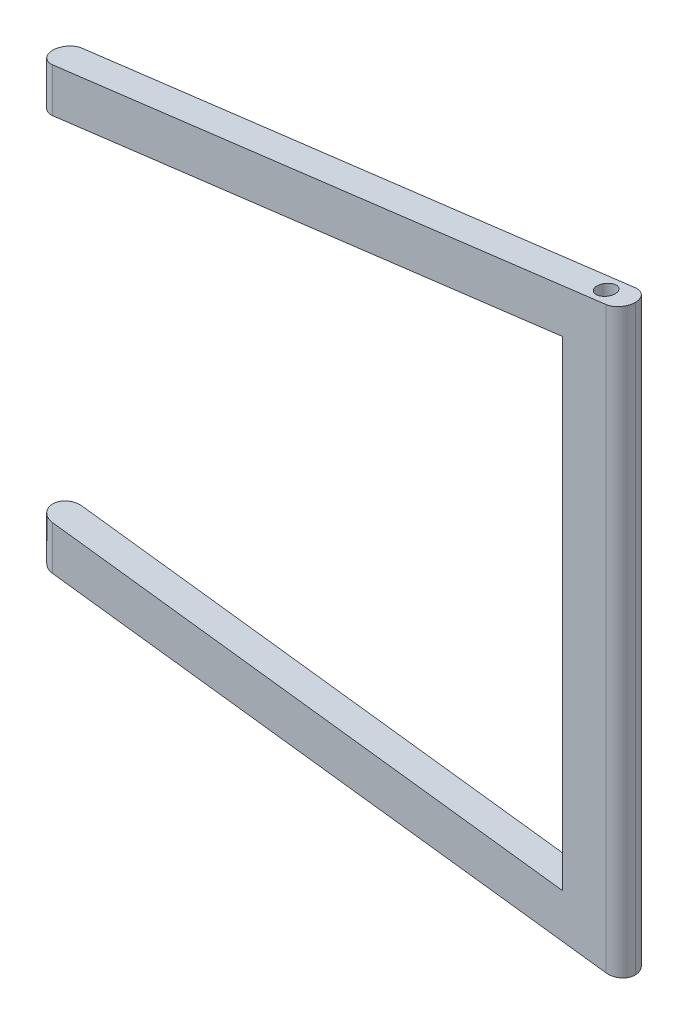
ISO-10303-21;
HEADER;
FILE_DESCRIPTION(('STEP AP214'),'2;1');
FILE_NAME('part.step','',(''),(''),'','','');
FILE_SCHEMA(('AUTOMOTIVE_DESIGN { 1 0 10303 214 1 1 1 1 }'));
ENDSEC;
DATA;
#1=APPLICATION_CONTEXT('core data for automotive mechanical design processes');
#2=APPLICATION_PROTOCOL_DEFINITION('international standard','automotive_design',2000,#1);
#3=PRODUCT_CONTEXT('',#1,'mechanical');
#4=PRODUCT('Part','Part','',(#3));
#5=PRODUCT_RELATED_PRODUCT_CATEGORY('part','',(#4));
#6=PRODUCT_DEFINITION_FORMATION('','',#4);
#7=PRODUCT_DEFINITION_CONTEXT('part definition',#1,'design');
#8=PRODUCT_DEFINITION('design','',#6,#7);
#9=PRODUCT_DEFINITION_SHAPE('','',#8);
#10=(LENGTH_UNIT() NAMED_UNIT(*) SI_UNIT(.MILLI.,.METRE.));
#11=(NAMED_UNIT(*) PLANE_ANGLE_UNIT() SI_UNIT($,.RADIAN.));
#12=(NAMED_UNIT(*) SI_UNIT($,.STERADIAN.) SOLID_ANGLE_UNIT());
#13=UNCERTAINTY_MEASURE_WITH_UNIT(LENGTH_MEASURE(1.E-05),#10,'distance_accuracy_value','');
#14=(GEOMETRIC_REPRESENTATION_CONTEXT(3) GLOBAL_UNCERTAINTY_ASSIGNED_CONTEXT((#13)) GLOBAL_UNIT_ASSIGNED_CONTEXT((#10,
#11,#12)) REPRESENTATION_CONTEXT('',''));
#15=CARTESIAN_POINT('',(0.,0.,0.));
#16=DIRECTION('',(0.,0.,1.));
#17=DIRECTION('',(1.,0.,0.));
#18=AXIS2_PLACEMENT_3D('',#15,#16,#17);
#19=CARTESIAN_POINT('',(0.,0.,40.));
#20=DIRECTION('',(0.,0.,1.));
#21=DIRECTION('',(1.,0.,0.));
#22=AXIS2_PLACEMENT_3D('',#19,#20,#21);
#23=PLANE('',#22);
#24=DIRECTION('',(0.,-1.,0.));
#25=VECTOR('',#24,1.);
#26=CARTESIAN_POINT('',(-280.,100.,40.));
#27=LINE('',#26,#25);
#28=CARTESIAN_POINT('',(-280.,702.5,40.));
#29=VERTEX_POINT('',#28);
#30=CARTESIAN_POINT('',(-280.,642.03306688776,40.));
#31=VERTEX_POINT('',#30);
#32=EDGE_CURVE('E149',#29,#31,#27,.T.);
#33=ORIENTED_EDGE('',*,*,#32,.T.);
#34=DIRECTION('',(-0.992277876713668,-0.124034734589209,0.));
#35=VECTOR('',#34,1.);
#36=CARTESIAN_POINT('',(-83.3271466938787,666.617173551026,40.));
#37=LINE('',#36,#35);
#38=CARTESIAN_POINT('',(420.,729.533066887761,40.));
#39=VERTEX_POINT('',#38);
#40=EDGE_CURVE('E137',#39,#31,#37,.T.);
#41=ORIENTED_EDGE('',*,*,#40,.F.);
#42=DIRECTION('',(0.,1.,0.));
#43=VECTOR('',#42,1.);
#44=CARTESIAN_POINT('',(420.,-1.7687666170592E-13,40.));
#45=LINE('',#44,#43);
#46=CARTESIAN_POINT('',(420.,70.4669331122391,40.));
#47=VERTEX_POINT('',#46);
#48=EDGE_CURVE('E127',#47,#39,#45,.T.);
#49=ORIENTED_EDGE('',*,*,#48,.F.);
#50=DIRECTION('',(0.992277876713668,-0.124034734589209,0.));
#51=VECTOR('',#50,1.);
#52=CARTESIAN_POINT('',(15.1343917676603,121.075134141281,40.));
#53=LINE('',#52,#51);
#54=CARTESIAN_POINT('',(-280.,157.966933112239,40.));
#55=VERTEX_POINT('',#54);
#56=EDGE_CURVE('E150',#55,#47,#53,.T.);
#57=ORIENTED_EDGE('',*,*,#56,.F.);
#58=CARTESIAN_POINT('',(-280.,97.5,40.));
#59=VERTEX_POINT('',#58);
#60=EDGE_CURVE('E206',#55,#59,#27,.T.);
#61=ORIENTED_EDGE('',*,*,#60,.T.);
#62=DIRECTION('',(0.992277876713668,-0.124034734589208,0.));
#63=VECTOR('',#62,1.);
#64=CARTESIAN_POINT('',(7.69230769230769,61.5384615384615,40.));
#65=LINE('',#64,#63);
#66=CARTESIAN_POINT('',(480.,2.5,40.));
#67=VERTEX_POINT('',#66);
#68=EDGE_CURVE('E172',#59,#67,#65,.T.);
#69=ORIENTED_EDGE('',*,*,#68,.T.);
#70=DIRECTION('',(0.,1.,0.));
#71=VECTOR('',#70,1.);
#72=CARTESIAN_POINT('',(480.,800.,40.));
#73=LINE('',#72,#71);
#74=CARTESIAN_POINT('',(480.,797.5,40.));
#75=VERTEX_POINT('',#74);
#76=EDGE_CURVE('E208',#67,#75,#73,.T.);
#77=ORIENTED_EDGE('',*,*,#76,.T.);
#78=DIRECTION('',(0.992277876713668,0.124034734589209,0.));
#79=VECTOR('',#78,1.);
#80=CARTESIAN_POINT('',(-90.7692307692311,726.153846153846,40.));
#81=LINE('',#80,#79);
#82=EDGE_CURVE('E169',#29,#75,#81,.T.);
#83=ORIENTED_EDGE('',*,*,#82,.F.);
#84=EDGE_LOOP('',(#33,#41,#49,#57,#61,#69,#77,#83));
#85=FACE_BOUND('',#84,.T.);
#86=ADVANCED_FACE('F42',(#85),#23,.T.);
#87=CARTESIAN_POINT('',(0.,0.,0.));
#88=DIRECTION('',(0.,0.,1.));
#89=DIRECTION('',(1.,0.,0.));
#90=AXIS2_PLACEMENT_3D('',#87,#88,#89);
#91=PLANE('',#90);
#92=DIRECTION('',(-0.992277876713668,-0.124034734589209,0.));
#93=VECTOR('',#92,1.);
#94=CARTESIAN_POINT('',(-83.3271466938787,666.617173551026,0.));
#95=LINE('',#94,#93);
#96=CARTESIAN_POINT('',(420.,729.533066887761,0.));
#97=VERTEX_POINT('',#96);
#98=CARTESIAN_POINT('',(-280.,642.03306688776,0.));
#99=VERTEX_POINT('',#98);
#100=EDGE_CURVE('E143',#97,#99,#95,.T.);
#101=ORIENTED_EDGE('',*,*,#100,.T.);
#102=DIRECTION('',(0.,-1.,0.));
#103=VECTOR('',#102,1.);
#104=CARTESIAN_POINT('',(-280.,0.,0.));
#105=LINE('',#104,#103);
#106=CARTESIAN_POINT('',(-280.,702.5,0.));
#107=VERTEX_POINT('',#106);
#108=EDGE_CURVE('E192',#99,#107,#105,.F.);
#109=ORIENTED_EDGE('',*,*,#108,.T.);
#110=DIRECTION('',(0.992277876713668,0.124034734589209,0.));
#111=VECTOR('',#110,1.);
#112=CARTESIAN_POINT('',(-90.7692307692311,726.153846153846,0.));
#113=LINE('',#112,#111);
#114=CARTESIAN_POINT('',(480.,797.5,0.));
#115=VERTEX_POINT('',#114);
#116=EDGE_CURVE('E167',#107,#115,#113,.T.);
#117=ORIENTED_EDGE('',*,*,#116,.T.);
#118=DIRECTION('',(0.,1.,0.));
#119=VECTOR('',#118,1.);
#120=CARTESIAN_POINT('',(480.,0.,0.));
#121=LINE('',#120,#119);
#122=CARTESIAN_POINT('',(480.,2.5,0.));
#123=VERTEX_POINT('',#122);
#124=EDGE_CURVE('E196',#115,#123,#121,.F.);
#125=ORIENTED_EDGE('',*,*,#124,.T.);
#126=DIRECTION('',(0.992277876713668,-0.124034734589208,0.));
#127=VECTOR('',#126,1.);
#128=CARTESIAN_POINT('',(7.69230769230769,61.5384615384615,0.));
#129=LINE('',#128,#127);
#130=CARTESIAN_POINT('',(-280.,97.5,0.));
#131=VERTEX_POINT('',#130);
#132=EDGE_CURVE('E173',#131,#123,#129,.T.);
#133=ORIENTED_EDGE('',*,*,#132,.F.);
#134=CARTESIAN_POINT('',(-280.,157.966933112239,0.));
#135=VERTEX_POINT('',#134);
#136=EDGE_CURVE('E193',#131,#135,#105,.F.);
#137=ORIENTED_EDGE('',*,*,#136,.T.);
#138=DIRECTION('',(0.992277876713668,-0.124034734589209,0.));
#139=VECTOR('',#138,1.);
#140=CARTESIAN_POINT('',(15.1343917676603,121.075134141281,0.));
#141=LINE('',#140,#139);
#142=CARTESIAN_POINT('',(420.,70.4669331122391,0.));
#143=VERTEX_POINT('',#142);
#144=EDGE_CURVE('E57',#135,#143,#141,.T.);
#145=ORIENTED_EDGE('',*,*,#144,.T.);
#146=DIRECTION('',(0.,1.,0.));
#147=VECTOR('',#146,1.);
#148=CARTESIAN_POINT('',(420.,-1.7687666170592E-13,0.));
#149=LINE('',#148,#147);
#150=EDGE_CURVE('E154',#143,#97,#149,.T.);
#151=ORIENTED_EDGE('',*,*,#150,.T.);
#152=EDGE_LOOP('',(#101,#109,#117,#125,#133,#137,#145,#151));
#153=FACE_BOUND('',#152,.T.);
#154=ADVANCED_FACE('F220',(#153),#91,.F.);
#155=CARTESIAN_POINT('',(-280.,0.,20.));
#156=DIRECTION('',(0.,1.,0.));
#157=DIRECTION('',(-1.,0.,0.));
#158=AXIS2_PLACEMENT_3D('',#155,#156,#157);
#159=CYLINDRICAL_SURFACE('',#158,20.);
#160=DIRECTION('',(0.,-1.,0.));
#161=VECTOR('',#160,1.);
#162=CARTESIAN_POINT('',(-300.,700.,20.));
#163=LINE('',#162,#161);
#164=CARTESIAN_POINT('',(-300.,639.53306688776,20.));
#165=VERTEX_POINT('',#164);
#166=CARTESIAN_POINT('',(-300.,700.,20.));
#167=VERTEX_POINT('',#166);
#168=EDGE_CURVE('E163',#165,#167,#163,.F.);
#169=ORIENTED_EDGE('',*,*,#168,.F.);
#170=CARTESIAN_POINT('',(-280.,642.03306688776,20.));
#171=DIRECTION('',(0.124034734589209,-0.992277876713668,0.));
#172=DIRECTION('',(0.992277876713668,0.124034734589209,0.));
#173=AXIS2_PLACEMENT_3D('',#170,#171,#172);
#174=ELLIPSE('',#173,20.1556443707464,20.);
#175=EDGE_CURVE('E161',#165,#31,#174,.F.);
#176=ORIENTED_EDGE('',*,*,#175,.T.);
#177=ORIENTED_EDGE('',*,*,#32,.F.);
#178=CARTESIAN_POINT('',(-280.,702.5,20.));
#179=DIRECTION('',(-0.124034734589209,0.992277876713668,0.));
#180=DIRECTION('',(0.992277876713668,0.124034734589209,0.));
#181=AXIS2_PLACEMENT_3D('',#178,#179,#180);
#182=ELLIPSE('',#181,20.1556443707464,20.);
#183=EDGE_CURVE('E176',#167,#29,#182,.T.);
#184=ORIENTED_EDGE('',*,*,#183,.F.);
#185=EDGE_LOOP('',(#169,#176,#177,#184));
#186=FACE_BOUND('',#185,.T.);
#187=ADVANCED_FACE('F44',(#186),#159,.T.);
#188=ORIENTED_EDGE('',*,*,#60,.F.);
#189=CARTESIAN_POINT('',(-280.,157.966933112239,20.));
#190=DIRECTION('',(0.124034734589209,0.992277876713668,0.));
#191=DIRECTION('',(-0.992277876713668,0.124034734589209,0.));
#192=AXIS2_PLACEMENT_3D('',#189,#190,#191);
#193=ELLIPSE('',#192,20.1556443707464,20.);
#194=CARTESIAN_POINT('',(-300.,160.466933112239,20.));
#195=VERTEX_POINT('',#194);
#196=EDGE_CURVE('E144',#55,#195,#193,.F.);
#197=ORIENTED_EDGE('',*,*,#196,.T.);
#198=CARTESIAN_POINT('',(-300.,100.,20.));
#199=VERTEX_POINT('',#198);
#200=EDGE_CURVE('E212',#199,#195,#163,.F.);
#201=ORIENTED_EDGE('',*,*,#200,.F.);
#202=CARTESIAN_POINT('',(-280.,97.5,20.));
#203=DIRECTION('',(0.124034734589208,0.992277876713668,0.));
#204=DIRECTION('',(-0.992277876713668,0.124034734589208,0.));
#205=AXIS2_PLACEMENT_3D('',#202,#203,#204);
#206=ELLIPSE('',#205,20.1556443707464,20.);
#207=EDGE_CURVE('E65',#59,#199,#206,.F.);
#208=ORIENTED_EDGE('',*,*,#207,.F.);
#209=EDGE_LOOP('',(#188,#197,#201,#208));
#210=FACE_BOUND('',#209,.T.);
#211=ADVANCED_FACE('F243',(#210),#159,.T.);
#212=CARTESIAN_POINT('',(-280.,0.,20.));
#213=DIRECTION('',(0.,-1.,0.));
#214=DIRECTION('',(1.,0.,0.));
#215=AXIS2_PLACEMENT_3D('',#212,#213,#214);
#216=CYLINDRICAL_SURFACE('',#215,20.);
#217=ORIENTED_EDGE('',*,*,#108,.F.);
#218=CARTESIAN_POINT('',(-280.,642.03306688776,20.));
#219=DIRECTION('',(0.124034734589209,-0.992277876713668,0.));
#220=DIRECTION('',(-0.992277876713668,-0.124034734589209,0.));
#221=AXIS2_PLACEMENT_3D('',#218,#219,#220);
#222=ELLIPSE('',#221,20.1556443707464,20.);
#223=EDGE_CURVE('E11',#99,#165,#222,.F.);
#224=ORIENTED_EDGE('',*,*,#223,.T.);
#225=ORIENTED_EDGE('',*,*,#168,.T.);
#226=CARTESIAN_POINT('',(-280.,702.5,20.));
#227=DIRECTION('',(-0.124034734589209,0.992277876713668,0.));
#228=DIRECTION('',(-0.992277876713668,-0.124034734589209,0.));
#229=AXIS2_PLACEMENT_3D('',#226,#227,#228);
#230=ELLIPSE('',#229,20.1556443707464,20.);
#231=EDGE_CURVE('E185',#107,#167,#230,.T.);
#232=ORIENTED_EDGE('',*,*,#231,.F.);
#233=EDGE_LOOP('',(#217,#224,#225,#232));
#234=FACE_BOUND('',#233,.T.);
#235=ADVANCED_FACE('F238',(#234),#216,.T.);
#236=ORIENTED_EDGE('',*,*,#200,.T.);
#237=CARTESIAN_POINT('',(-280.,157.966933112239,20.));
#238=DIRECTION('',(0.124034734589209,0.992277876713668,0.));
#239=DIRECTION('',(0.992277876713668,-0.124034734589209,0.));
#240=AXIS2_PLACEMENT_3D('',#237,#238,#239);
#241=ELLIPSE('',#240,20.1556443707464,20.);
#242=EDGE_CURVE('E50',#195,#135,#241,.F.);
#243=ORIENTED_EDGE('',*,*,#242,.T.);
#244=ORIENTED_EDGE('',*,*,#136,.F.);
#245=CARTESIAN_POINT('',(-280.,97.5,20.));
#246=DIRECTION('',(0.124034734589208,0.992277876713668,0.));
#247=DIRECTION('',(0.992277876713668,-0.124034734589208,0.));
#248=AXIS2_PLACEMENT_3D('',#245,#246,#247);
#249=ELLIPSE('',#248,20.1556443707464,20.);
#250=EDGE_CURVE('E200',#199,#131,#249,.F.);
#251=ORIENTED_EDGE('',*,*,#250,.F.);
#252=EDGE_LOOP('',(#236,#243,#244,#251));
#253=FACE_BOUND('',#252,.T.);
#254=ADVANCED_FACE('F216',(#253),#216,.T.);
#255=CARTESIAN_POINT('',(-90.7692307692311,726.153846153846,40.));
#256=DIRECTION('',(-0.124034734589209,0.992277876713668,0.));
#257=DIRECTION('',(-0.992277876713668,-0.124034734589209,0.));
#258=AXIS2_PLACEMENT_3D('',#255,#256,#257);
#259=PLANE('',#258);
#260=CARTESIAN_POINT('',(460.,795.,20.));
#261=DIRECTION('',(-0.124034734589209,0.992277876713668,0.));
#262=DIRECTION('',(-0.992277876713668,-0.124034734589209,0.));
#263=AXIS2_PLACEMENT_3D('',#260,#261,#262);
#264=ELLIPSE('',#263,12.5972777317165,12.5);
#265=CARTESIAN_POINT('',(447.5,793.4375,20.));
#266=VERTEX_POINT('',#265);
#267=EDGE_CURVE('E164',#266,#266,#264,.F.);
#268=ORIENTED_EDGE('',*,*,#267,.T.);
#269=EDGE_LOOP('',(#268));
#270=FACE_BOUND('',#269,.T.);
#271=CARTESIAN_POINT('',(480.,797.5,20.));
#272=DIRECTION('',(-0.124034734589209,0.992277876713668,0.));
#273=DIRECTION('',(-0.992277876713668,-0.124034734589209,0.));
#274=AXIS2_PLACEMENT_3D('',#271,#272,#273);
#275=ELLIPSE('',#274,20.1556443707464,20.);
#276=CARTESIAN_POINT('',(500.,800.,20.));
#277=VERTEX_POINT('',#276);
#278=EDGE_CURVE('E188',#75,#277,#275,.T.);
#279=ORIENTED_EDGE('',*,*,#278,.T.);
#280=CARTESIAN_POINT('',(480.,797.5,20.));
#281=DIRECTION('',(-0.124034734589209,0.992277876713668,0.));
#282=DIRECTION('',(0.992277876713668,0.124034734589209,0.));
#283=AXIS2_PLACEMENT_3D('',#280,#281,#282);
#284=ELLIPSE('',#283,20.1556443707464,20.);
#285=EDGE_CURVE('E190',#277,#115,#284,.T.);
#286=ORIENTED_EDGE('',*,*,#285,.T.);
#287=ORIENTED_EDGE('',*,*,#116,.F.);
#288=ORIENTED_EDGE('',*,*,#231,.T.);
#289=ORIENTED_EDGE('',*,*,#183,.T.);
#290=ORIENTED_EDGE('',*,*,#82,.T.);
#291=EDGE_LOOP('',(#279,#286,#287,#288,#289,#290));
#292=FACE_BOUND('',#291,.T.);
#293=ADVANCED_FACE('F234',(#270,#292),#259,.T.);
#294=CARTESIAN_POINT('',(7.69230769230769,61.5384615384615,40.));
#295=DIRECTION('',(0.124034734589208,0.992277876713668,0.));
#296=DIRECTION('',(-0.992277876713668,0.124034734589208,0.));
#297=AXIS2_PLACEMENT_3D('',#294,#295,#296);
#298=PLANE('',#297);
#299=CARTESIAN_POINT('',(460.,4.99999999999989,20.));
#300=DIRECTION('',(0.124034734589208,0.992277876713668,0.));
#301=DIRECTION('',(0.992277876713668,-0.124034734589208,0.));
#302=AXIS2_PLACEMENT_3D('',#299,#300,#301);
#303=ELLIPSE('',#302,12.5972777317165,12.5);
#304=CARTESIAN_POINT('',(472.5,3.43749999999989,20.));
#305=VERTEX_POINT('',#304);
#306=EDGE_CURVE('E168',#305,#305,#303,.F.);
#307=ORIENTED_EDGE('',*,*,#306,.F.);
#308=EDGE_LOOP('',(#307));
#309=FACE_BOUND('',#308,.T.);
#310=ORIENTED_EDGE('',*,*,#132,.T.);
#311=CARTESIAN_POINT('',(480.,2.5,20.));
#312=DIRECTION('',(0.124034734589208,0.992277876713668,0.));
#313=DIRECTION('',(-0.992277876713668,0.124034734589208,0.));
#314=AXIS2_PLACEMENT_3D('',#311,#312,#313);
#315=ELLIPSE('',#314,20.1556443707464,20.);
#316=CARTESIAN_POINT('',(500.,0.,20.));
#317=VERTEX_POINT('',#316);
#318=EDGE_CURVE('E204',#123,#317,#315,.F.);
#319=ORIENTED_EDGE('',*,*,#318,.T.);
#320=CARTESIAN_POINT('',(480.,2.5,20.));
#321=DIRECTION('',(0.124034734589208,0.992277876713668,0.));
#322=DIRECTION('',(0.992277876713668,-0.124034734589208,0.));
#323=AXIS2_PLACEMENT_3D('',#320,#321,#322);
#324=ELLIPSE('',#323,20.1556443707464,20.);
#325=EDGE_CURVE('E202',#317,#67,#324,.F.);
#326=ORIENTED_EDGE('',*,*,#325,.T.);
#327=ORIENTED_EDGE('',*,*,#68,.F.);
#328=ORIENTED_EDGE('',*,*,#207,.T.);
#329=ORIENTED_EDGE('',*,*,#250,.T.);
#330=EDGE_LOOP('',(#310,#319,#326,#327,#328,#329));
#331=FACE_BOUND('',#330,.T.);
#332=ADVANCED_FACE('F222',(#309,#331),#298,.F.);
#333=CARTESIAN_POINT('',(460.,800.,20.));
#334=DIRECTION('',(0.,-1.,0.));
#335=DIRECTION('',(0.,0.,-1.));
#336=AXIS2_PLACEMENT_3D('',#333,#334,#335);
#337=CYLINDRICAL_SURFACE('',#336,12.5);
#338=ORIENTED_EDGE('',*,*,#267,.F.);
#339=EDGE_LOOP('',(#338));
#340=FACE_BOUND('',#339,.T.);
#341=ORIENTED_EDGE('',*,*,#306,.T.);
#342=EDGE_LOOP('',(#341));
#343=FACE_BOUND('',#342,.T.);
#344=ADVANCED_FACE('F255',(#340,#343),#337,.F.);
#345=CARTESIAN_POINT('',(480.,0.,20.));
#346=DIRECTION('',(0.,-1.,0.));
#347=DIRECTION('',(1.,0.,0.));
#348=AXIS2_PLACEMENT_3D('',#345,#346,#347);
#349=CYLINDRICAL_SURFACE('',#348,20.);
#350=ORIENTED_EDGE('',*,*,#76,.F.);
#351=ORIENTED_EDGE('',*,*,#325,.F.);
#352=DIRECTION('',(0.,1.,0.));
#353=VECTOR('',#352,1.);
#354=CARTESIAN_POINT('',(500.,0.,20.));
#355=LINE('',#354,#353);
#356=EDGE_CURVE('E183',#277,#317,#355,.F.);
#357=ORIENTED_EDGE('',*,*,#356,.F.);
#358=ORIENTED_EDGE('',*,*,#278,.F.);
#359=EDGE_LOOP('',(#350,#351,#357,#358));
#360=FACE_BOUND('',#359,.T.);
#361=ADVANCED_FACE('F228',(#360),#349,.T.);
#362=CARTESIAN_POINT('',(480.,0.,20.));
#363=DIRECTION('',(0.,1.,0.));
#364=DIRECTION('',(-1.,0.,0.));
#365=AXIS2_PLACEMENT_3D('',#362,#363,#364);
#366=CYLINDRICAL_SURFACE('',#365,20.);
#367=ORIENTED_EDGE('',*,*,#318,.F.);
#368=ORIENTED_EDGE('',*,*,#124,.F.);
#369=ORIENTED_EDGE('',*,*,#285,.F.);
#370=ORIENTED_EDGE('',*,*,#356,.T.);
#371=EDGE_LOOP('',(#367,#368,#369,#370));
#372=FACE_BOUND('',#371,.T.);
#373=ADVANCED_FACE('F231',(#372),#366,.T.);
#374=CARTESIAN_POINT('',(420.,-1.7687666170592E-13,40.));
#375=DIRECTION('',(-1.,0.,0.));
#376=DIRECTION('',(0.,-1.,0.));
#377=AXIS2_PLACEMENT_3D('',#374,#375,#376);
#378=PLANE('',#377);
#379=ORIENTED_EDGE('',*,*,#150,.F.);
#380=DIRECTION('',(0.,0.,-1.));
#381=VECTOR('',#380,1.);
#382=CARTESIAN_POINT('',(420.,70.4669331122391,40.));
#383=LINE('',#382,#381);
#384=EDGE_CURVE('E133',#47,#143,#383,.T.);
#385=ORIENTED_EDGE('',*,*,#384,.F.);
#386=ORIENTED_EDGE('',*,*,#48,.T.);
#387=DIRECTION('',(0.,0.,-1.));
#388=VECTOR('',#387,1.);
#389=CARTESIAN_POINT('',(420.,729.533066887761,40.));
#390=LINE('',#389,#388);
#391=EDGE_CURVE('E131',#39,#97,#390,.T.);
#392=ORIENTED_EDGE('',*,*,#391,.T.);
#393=EDGE_LOOP('',(#379,#385,#386,#392));
#394=FACE_BOUND('',#393,.T.);
#395=ADVANCED_FACE('F130',(#394),#378,.T.);
#396=CARTESIAN_POINT('',(-83.3271466938787,666.617173551026,40.));
#397=DIRECTION('',(0.124034734589209,-0.992277876713668,0.));
#398=DIRECTION('',(0.992277876713668,0.124034734589209,0.));
#399=AXIS2_PLACEMENT_3D('',#396,#397,#398);
#400=PLANE('',#399);
#401=ORIENTED_EDGE('',*,*,#223,.F.);
#402=ORIENTED_EDGE('',*,*,#100,.F.);
#403=ORIENTED_EDGE('',*,*,#391,.F.);
#404=ORIENTED_EDGE('',*,*,#40,.T.);
#405=ORIENTED_EDGE('',*,*,#175,.F.);
#406=EDGE_LOOP('',(#401,#402,#403,#404,#405));
#407=FACE_BOUND('',#406,.T.);
#408=ADVANCED_FACE('F140',(#407),#400,.T.);
#409=CARTESIAN_POINT('',(15.1343917676603,121.075134141281,40.));
#410=DIRECTION('',(0.124034734589209,0.992277876713668,0.));
#411=DIRECTION('',(-0.992277876713668,0.124034734589209,0.));
#412=AXIS2_PLACEMENT_3D('',#409,#410,#411);
#413=PLANE('',#412);
#414=ORIENTED_EDGE('',*,*,#56,.T.);
#415=ORIENTED_EDGE('',*,*,#384,.T.);
#416=ORIENTED_EDGE('',*,*,#144,.F.);
#417=ORIENTED_EDGE('',*,*,#242,.F.);
#418=ORIENTED_EDGE('',*,*,#196,.F.);
#419=EDGE_LOOP('',(#414,#415,#416,#417,#418));
#420=FACE_BOUND('',#419,.T.);
#421=ADVANCED_FACE('F306',(#420),#413,.T.);
#422=CLOSED_SHELL('',(#86,#154,#187,#211,#235,#254,#293,#332,#344,#361,#373,#395,#408,#421));
#423=MANIFOLD_SOLID_BREP('B2',#422);
#424=ADVANCED_BREP_SHAPE_REPRESENTATION('',(#18,#423),#14);
#425=SHAPE_DEFINITION_REPRESENTATION(#9,#424);
ENDSEC;
END-ISO-10303-21;
